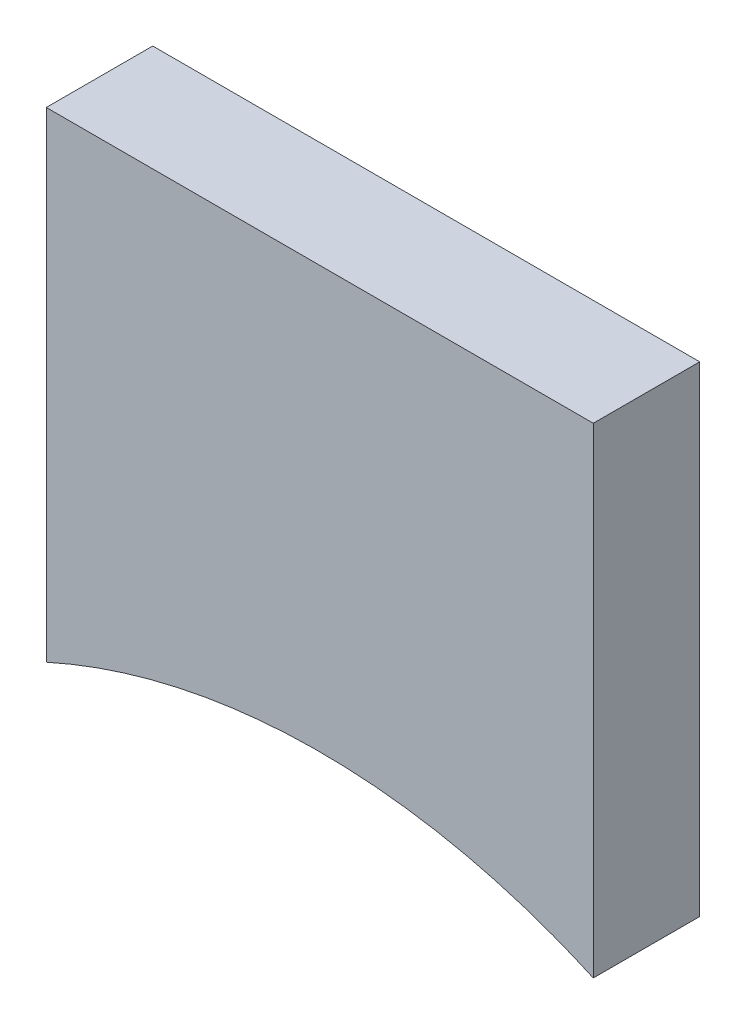
ISO-10303-21;
HEADER;
FILE_DESCRIPTION(('STEP AP214'),'2;1');
FILE_NAME('part.step','',(''),(''),'','','');
FILE_SCHEMA(('AUTOMOTIVE_DESIGN { 1 0 10303 214 1 1 1 1 }'));
ENDSEC;
DATA;
#1=APPLICATION_CONTEXT('core data for automotive mechanical design processes');
#2=APPLICATION_PROTOCOL_DEFINITION('international standard','automotive_design',2000,#1);
#3=PRODUCT_CONTEXT('',#1,'mechanical');
#4=PRODUCT('Part','Part','',(#3));
#5=PRODUCT_RELATED_PRODUCT_CATEGORY('part','',(#4));
#6=PRODUCT_DEFINITION_FORMATION('','',#4);
#7=PRODUCT_DEFINITION_CONTEXT('part definition',#1,'design');
#8=PRODUCT_DEFINITION('design','',#6,#7);
#9=PRODUCT_DEFINITION_SHAPE('','',#8);
#10=(LENGTH_UNIT() NAMED_UNIT(*) SI_UNIT(.MILLI.,.METRE.));
#11=(NAMED_UNIT(*) PLANE_ANGLE_UNIT() SI_UNIT($,.RADIAN.));
#12=(NAMED_UNIT(*) SI_UNIT($,.STERADIAN.) SOLID_ANGLE_UNIT());
#13=UNCERTAINTY_MEASURE_WITH_UNIT(LENGTH_MEASURE(1.E-05),#10,'distance_accuracy_value','');
#14=(GEOMETRIC_REPRESENTATION_CONTEXT(3) GLOBAL_UNCERTAINTY_ASSIGNED_CONTEXT((#13)) GLOBAL_UNIT_ASSIGNED_CONTEXT((#10,
#11,#12)) REPRESENTATION_CONTEXT('',''));
#15=CARTESIAN_POINT('',(0.,0.,0.));
#16=DIRECTION('',(0.,0.,1.));
#17=DIRECTION('',(1.,0.,0.));
#18=AXIS2_PLACEMENT_3D('',#15,#16,#17);
#19=CARTESIAN_POINT('',(23.8223531016636,-10.0590284761626,-1.08278048692806));
#20=CARTESIAN_POINT('',(21.9722049773914,-9.21980119114396,-1.08278045024425));
#21=CARTESIAN_POINT('',(20.122056706384,-10.0590281526722,-1.08278048692803));
#22=CARTESIAN_POINT('',(23.8223531016636,-10.0590285076348,-0.362780486928058));
#23=CARTESIAN_POINT('',(21.9722049773914,-9.21980122261617,-0.362780450244244));
#24=CARTESIAN_POINT('',(20.122056706384,-10.0590281841444,-0.36278048692803));
#25=(BOUNDED_SURFACE() B_SPLINE_SURFACE(1,2,((#19,#20,#21),(#22,#23,#24)),.UNSPECIFIED.,.F.,.F.,
.F.) B_SPLINE_SURFACE_WITH_KNOTS((2,2),(3,3),(0.,0.160756970940835),(-0.85168721602033,
1.04252364895218E-13),
.UNSPECIFIED.) GEOMETRIC_REPRESENTATION_ITEM() RATIONAL_B_SPLINE_SURFACE(((1.,0.910690571699547,
1.),(1.,0.910690571699547,1.))) REPRESENTATION_ITEM('') SURFACE());
#26=CARTESIAN_POINT('',(20.1220567063836,-10.0590281841446,-0.36278048692803));
#27=CARTESIAN_POINT('',(21.9722049773912,-9.21980122261628,-0.362780450244244));
#28=CARTESIAN_POINT('',(23.8223531016636,-10.0590285076349,-0.362780486928058));
#29=(BOUNDED_CURVE() B_SPLINE_CURVE(2,(#26,#27,#28),.UNSPECIFIED.,.F.,
.F.) B_SPLINE_CURVE_WITH_KNOTS((3,3),(0.,0.851687216020322),
.UNSPECIFIED.) CURVE() GEOMETRIC_REPRESENTATION_ITEM() RATIONAL_B_SPLINE_CURVE((1.,
0.910690571699551,1.)) REPRESENTATION_ITEM(''));
#30=CARTESIAN_POINT('',(20.1220567063836,-10.0590281841447,-0.36278048692803));
#31=VERTEX_POINT('',#30);
#32=CARTESIAN_POINT('',(23.8223531016636,-10.0590285076349,-0.362780486928059));
#33=VERTEX_POINT('',#32);
#34=EDGE_CURVE('E11',#31,#33,#29,.T.);
#35=CARTESIAN_POINT('',(20.1220567063836,-10.0590281526725,-1.08278048692803));
#36=CARTESIAN_POINT('',(20.1220567063836,-10.0590281841447,-0.36278048692803));
#37=(BOUNDED_CURVE() B_SPLINE_CURVE(1,(#35,#36),.UNSPECIFIED.,.F.,
.F.) B_SPLINE_CURVE_WITH_KNOTS((2,2),(0.,0.00072),
.UNSPECIFIED.) CURVE() GEOMETRIC_REPRESENTATION_ITEM() RATIONAL_B_SPLINE_CURVE((1.,1.)) REPRESENTATION_ITEM(''));
#38=CARTESIAN_POINT('',(20.1220567063836,-10.0590281526725,-1.08278048692803));
#39=VERTEX_POINT('',#38);
#40=EDGE_CURVE('E74',#39,#31,#37,.T.);
#41=CARTESIAN_POINT('',(23.8223531016636,-10.0590284761626,-1.08278048692805));
#42=CARTESIAN_POINT('',(21.9722049773911,-9.21980119114397,-1.08278045024424));
#43=CARTESIAN_POINT('',(20.1220567063835,-10.0590281526723,-1.08278048692802));
#44=(BOUNDED_CURVE() B_SPLINE_CURVE(2,(#41,#42,#43),.UNSPECIFIED.,.F.,
.F.) B_SPLINE_CURVE_WITH_KNOTS((3,3),(-0.851687216020322,1.03746451217817E-13),
.UNSPECIFIED.) CURVE() GEOMETRIC_REPRESENTATION_ITEM() RATIONAL_B_SPLINE_CURVE((1.,
0.910690571699553,1.)) REPRESENTATION_ITEM(''));
#45=CARTESIAN_POINT('',(23.8223531016636,-10.0590284761626,-1.08278048692806));
#46=VERTEX_POINT('',#45);
#47=EDGE_CURVE('E75',#46,#39,#44,.T.);
#48=CARTESIAN_POINT('',(23.8223531016636,-10.0590285076349,-0.362780486928059));
#49=CARTESIAN_POINT('',(23.8223531016636,-10.0590284761627,-1.08278048692806));
#50=(BOUNDED_CURVE() B_SPLINE_CURVE(1,(#48,#49),.UNSPECIFIED.,.F.,
.F.) B_SPLINE_CURVE_WITH_KNOTS((2,2),(0.,0.00072),
.UNSPECIFIED.) CURVE() GEOMETRIC_REPRESENTATION_ITEM() RATIONAL_B_SPLINE_CURVE((1.,1.)) REPRESENTATION_ITEM(''));
#51=EDGE_CURVE('E70',#33,#46,#50,.T.);
#52=ORIENTED_EDGE('',*,*,#34,.F.);
#53=ORIENTED_EDGE('',*,*,#40,.F.);
#54=ORIENTED_EDGE('',*,*,#47,.F.);
#55=ORIENTED_EDGE('',*,*,#51,.F.);
#56=EDGE_LOOP('',(#52,#53,#54,#55));
#57=FACE_BOUND('',#56,.T.);
#58=ADVANCED_FACE('F17',(#57),#25,.T.);
#59=CARTESIAN_POINT('',(19.7520270100307,-10.3840285076349,-0.362780501134251));
#60=CARTESIAN_POINT('',(19.7520273509796,-6.48402811944664,-0.362780330659738));
#61=CARTESIAN_POINT('',(24.1923830253156,-10.3840288958232,-0.362780501134285));
#62=CARTESIAN_POINT('',(24.1923833662644,-6.4840285076349,-0.362780330659772));
#63=(BOUNDED_SURFACE() B_SPLINE_SURFACE(1,1,((#59,#60),(#61,#62)),.UNSPECIFIED.,.F.,.F.,
.F.) B_SPLINE_SURFACE_WITH_KNOTS((2,2),(2,2),(-0.000370029667940436,0.00407032634734442),
(-0.000325000355839223,0.00357500003234905),
.UNSPECIFIED.) GEOMETRIC_REPRESENTATION_ITEM() RATIONAL_B_SPLINE_SURFACE(((1.,1.),(1.,1.))) REPRESENTATION_ITEM('') SURFACE());
#64=CARTESIAN_POINT('',(23.8223531016636,-10.0590285076349,-0.362780486928059));
#65=CARTESIAN_POINT('',(23.8223533857876,-6.80902850763487,-0.362780344865979));
#66=(BOUNDED_CURVE() B_SPLINE_CURVE(1,(#64,#65),.UNSPECIFIED.,.F.,
.F.) B_SPLINE_CURVE_WITH_KNOTS((2,2),(0.,0.00325),
.UNSPECIFIED.) CURVE() GEOMETRIC_REPRESENTATION_ITEM() RATIONAL_B_SPLINE_CURVE((1.,1.)) REPRESENTATION_ITEM(''));
#67=CARTESIAN_POINT('',(23.8223533857876,-6.80902850763487,-0.362780344865978));
#68=VERTEX_POINT('',#67);
#69=EDGE_CURVE('E32',#33,#68,#66,.T.);
#70=CARTESIAN_POINT('',(20.1220569905076,-6.80902818414469,-0.36278034486595));
#71=CARTESIAN_POINT('',(23.8223533857876,-6.80902850763487,-0.362780344865978));
#72=(BOUNDED_CURVE() B_SPLINE_CURVE(1,(#70,#71),.UNSPECIFIED.,.F.,
.F.) B_SPLINE_CURVE_WITH_KNOTS((2,2),(0.,0.00370029639528),
.UNSPECIFIED.) CURVE() GEOMETRIC_REPRESENTATION_ITEM() RATIONAL_B_SPLINE_CURVE((1.,1.)) REPRESENTATION_ITEM(''));
#73=CARTESIAN_POINT('',(20.1220569905076,-6.80902818414469,-0.36278034486595));
#74=VERTEX_POINT('',#73);
#75=EDGE_CURVE('E90',#74,#68,#72,.T.);
#76=CARTESIAN_POINT('',(20.1220567063836,-10.0590281841447,-0.36278048692803));
#77=CARTESIAN_POINT('',(20.1220569905076,-6.80902818414469,-0.36278034486595));
#78=(BOUNDED_CURVE() B_SPLINE_CURVE(1,(#76,#77),.UNSPECIFIED.,.F.,
.F.) B_SPLINE_CURVE_WITH_KNOTS((2,2),(0.,0.00325),
.UNSPECIFIED.) CURVE() GEOMETRIC_REPRESENTATION_ITEM() RATIONAL_B_SPLINE_CURVE((1.,1.)) REPRESENTATION_ITEM(''));
#79=EDGE_CURVE('E65',#31,#74,#78,.T.);
#80=ORIENTED_EDGE('',*,*,#34,.T.);
#81=ORIENTED_EDGE('',*,*,#69,.T.);
#82=ORIENTED_EDGE('',*,*,#75,.F.);
#83=ORIENTED_EDGE('',*,*,#79,.F.);
#84=EDGE_LOOP('',(#80,#81,#82,#83));
#85=FACE_BOUND('',#84,.T.);
#86=ADVANCED_FACE('F167',(#85),#63,.T.);
#87=CARTESIAN_POINT('',(23.8223530732512,-10.3840285107821,-0.290780501134265));
#88=CARTESIAN_POINT('',(23.8223534142,-6.48402851078209,-0.29078033065977));
#89=CARTESIAN_POINT('',(23.8223530732512,-10.3840284730155,-1.15478050113427));
#90=CARTESIAN_POINT('',(23.8223534142,-6.48402847301543,-1.15478033065977));
#91=(BOUNDED_SURFACE() B_SPLINE_SURFACE(1,1,((#87,#88),(#89,#90)),.UNSPECIFIED.,.F.,.F.,
.F.) B_SPLINE_SURFACE_WITH_KNOTS((2,2),(2,2),(-7.20000000000017E-05,0.000792),
(-0.000325000000000005,0.00357500000000005),
.UNSPECIFIED.) GEOMETRIC_REPRESENTATION_ITEM() RATIONAL_B_SPLINE_SURFACE(((1.,1.),(1.,1.))) REPRESENTATION_ITEM('') SURFACE());
#92=CARTESIAN_POINT('',(23.8223531016636,-10.0590284761626,-1.08278048692806));
#93=CARTESIAN_POINT('',(23.8223533857876,-6.80902847616266,-1.08278034486598));
#94=(BOUNDED_CURVE() B_SPLINE_CURVE(1,(#92,#93),.UNSPECIFIED.,.F.,
.F.) B_SPLINE_CURVE_WITH_KNOTS((2,2),(0.,0.00324999999999994),
.UNSPECIFIED.) CURVE() GEOMETRIC_REPRESENTATION_ITEM() RATIONAL_B_SPLINE_CURVE((1.,1.)) REPRESENTATION_ITEM(''));
#95=CARTESIAN_POINT('',(23.8223533857876,-6.80902847616266,-1.08278034486598));
#96=VERTEX_POINT('',#95);
#97=EDGE_CURVE('E51',#46,#96,#94,.T.);
#98=CARTESIAN_POINT('',(23.8223533857876,-6.80902850763487,-0.362780344865978));
#99=CARTESIAN_POINT('',(23.8223533857876,-6.80902847616266,-1.08278034486598));
#100=(BOUNDED_CURVE() B_SPLINE_CURVE(1,(#98,#99),.UNSPECIFIED.,.F.,
.F.) B_SPLINE_CURVE_WITH_KNOTS((2,2),(0.,0.00072),
.UNSPECIFIED.) CURVE() GEOMETRIC_REPRESENTATION_ITEM() RATIONAL_B_SPLINE_CURVE((1.,1.)) REPRESENTATION_ITEM(''));
#101=EDGE_CURVE('E85',#68,#96,#100,.T.);
#102=ORIENTED_EDGE('',*,*,#51,.T.);
#103=ORIENTED_EDGE('',*,*,#97,.T.);
#104=ORIENTED_EDGE('',*,*,#101,.F.);
#105=ORIENTED_EDGE('',*,*,#69,.F.);
#106=EDGE_LOOP('',(#102,#103,#104,#105));
#107=FACE_BOUND('',#106,.T.);
#108=ADVANCED_FACE('F166',(#107),#91,.T.);
#109=CARTESIAN_POINT('',(20.1220566779712,-10.3840281495253,-1.15478050113424));
#110=CARTESIAN_POINT('',(20.12205701892,-6.48402814952525,-1.15478033065974));
#111=CARTESIAN_POINT('',(20.1220566779712,-10.3840281872919,-0.290780501134238));
#112=CARTESIAN_POINT('',(20.12205701892,-6.48402818729191,-0.290780330659742));
#113=(BOUNDED_SURFACE() B_SPLINE_SURFACE(1,1,((#109,#110),(#111,#112)),.UNSPECIFIED.,.F.,.F.,
.F.) B_SPLINE_SURFACE_WITH_KNOTS((2,2),(2,2),(-7.2E-05,0.000792),(-0.000325000000000005,
0.003575),.UNSPECIFIED.) GEOMETRIC_REPRESENTATION_ITEM() RATIONAL_B_SPLINE_SURFACE(((1.,1.),(1.,1.))) REPRESENTATION_ITEM('') SURFACE());
#114=CARTESIAN_POINT('',(20.1220569905076,-6.80902815267248,-1.08278034486595));
#115=CARTESIAN_POINT('',(20.1220569905076,-6.80902818414469,-0.36278034486595));
#116=(BOUNDED_CURVE() B_SPLINE_CURVE(1,(#114,#115),.UNSPECIFIED.,.F.,
.F.) B_SPLINE_CURVE_WITH_KNOTS((2,2),(0.,0.00072),
.UNSPECIFIED.) CURVE() GEOMETRIC_REPRESENTATION_ITEM() RATIONAL_B_SPLINE_CURVE((1.,1.)) REPRESENTATION_ITEM(''));
#117=CARTESIAN_POINT('',(20.1220569905076,-6.80902815267248,-1.08278034486595));
#118=VERTEX_POINT('',#117);
#119=EDGE_CURVE('E80',#118,#74,#116,.T.);
#120=CARTESIAN_POINT('',(20.1220567063836,-10.0590281526725,-1.08278048692803));
#121=CARTESIAN_POINT('',(20.1220569905076,-6.80902815267248,-1.08278034486595));
#122=(BOUNDED_CURVE() B_SPLINE_CURVE(1,(#120,#121),.UNSPECIFIED.,.F.,
.F.) B_SPLINE_CURVE_WITH_KNOTS((2,2),(0.,0.00325),
.UNSPECIFIED.) CURVE() GEOMETRIC_REPRESENTATION_ITEM() RATIONAL_B_SPLINE_CURVE((1.,1.)) REPRESENTATION_ITEM(''));
#123=EDGE_CURVE('E23',#39,#118,#122,.T.);
#124=ORIENTED_EDGE('',*,*,#40,.T.);
#125=ORIENTED_EDGE('',*,*,#79,.T.);
#126=ORIENTED_EDGE('',*,*,#119,.F.);
#127=ORIENTED_EDGE('',*,*,#123,.F.);
#128=EDGE_LOOP('',(#124,#125,#126,#127));
#129=FACE_BOUND('',#128,.T.);
#130=ADVANCED_FACE('F78',(#129),#113,.T.);
#131=CARTESIAN_POINT('',(24.1923827127792,-10.3840285085117,-1.08278050113427));
#132=CARTESIAN_POINT('',(24.192383053728,-6.48402850851167,-1.08278033065978));
#133=CARTESIAN_POINT('',(19.7520270384431,-10.3840281203235,-1.08278050113424));
#134=CARTESIAN_POINT('',(19.752027379392,-6.48402812032345,-1.08278033065974));
#135=(BOUNDED_SURFACE() B_SPLINE_SURFACE(1,1,((#131,#132),(#133,#134)),.UNSPECIFIED.,.F.,.F.,
.F.) B_SPLINE_SURFACE_WITH_KNOTS((2,2),(2,2),(-0.000370029639528023,0.00407032603480809),
(-0.000325000000000091,0.003575),
.UNSPECIFIED.) GEOMETRIC_REPRESENTATION_ITEM() RATIONAL_B_SPLINE_SURFACE(((1.,1.),(1.,1.))) REPRESENTATION_ITEM('') SURFACE());
#136=CARTESIAN_POINT('',(23.8223533857876,-6.80902847616266,-1.08278034486598));
#137=CARTESIAN_POINT('',(20.1220569905076,-6.80902815267248,-1.08278034486595));
#138=(BOUNDED_CURVE() B_SPLINE_CURVE(1,(#136,#137),.UNSPECIFIED.,.F.,
.F.) B_SPLINE_CURVE_WITH_KNOTS((2,2),(0.,0.00370029639528),
.UNSPECIFIED.) CURVE() GEOMETRIC_REPRESENTATION_ITEM() RATIONAL_B_SPLINE_CURVE((1.,1.)) REPRESENTATION_ITEM(''));
#139=EDGE_CURVE('E146',#96,#118,#138,.T.);
#140=ORIENTED_EDGE('',*,*,#47,.T.);
#141=ORIENTED_EDGE('',*,*,#123,.T.);
#142=ORIENTED_EDGE('',*,*,#139,.F.);
#143=ORIENTED_EDGE('',*,*,#97,.F.);
#144=EDGE_LOOP('',(#140,#141,#142,#143));
#145=FACE_BOUND('',#144,.T.);
#146=ADVANCED_FACE('F83',(#145),#135,.T.);
#147=CARTESIAN_POINT('',(19.7520273509796,-6.8090281549429,-0.290780344865947));
#148=CARTESIAN_POINT('',(19.7520273509796,-6.80902811717624,-1.15478034486595));
#149=CARTESIAN_POINT('',(24.1923830253156,-6.80902854313112,-0.29078034486598));
#150=CARTESIAN_POINT('',(24.1923830253156,-6.80902850536446,-1.15478034486598));
#151=(BOUNDED_SURFACE() B_SPLINE_SURFACE(1,1,((#147,#148),(#149,#150)),.UNSPECIFIED.,.F.,.F.,
.F.) B_SPLINE_SURFACE_WITH_KNOTS((2,2),(2,2),(-0.00222017783716801,0.00222017783716802),
(-0.000432,0.000432),
.UNSPECIFIED.) GEOMETRIC_REPRESENTATION_ITEM() RATIONAL_B_SPLINE_SURFACE(((1.,1.),(1.,1.))) REPRESENTATION_ITEM('') SURFACE());
#152=ORIENTED_EDGE('',*,*,#139,.T.);
#153=ORIENTED_EDGE('',*,*,#119,.T.);
#154=ORIENTED_EDGE('',*,*,#75,.T.);
#155=ORIENTED_EDGE('',*,*,#101,.T.);
#156=EDGE_LOOP('',(#152,#153,#154,#155));
#157=FACE_BOUND('',#156,.T.);
#158=ADVANCED_FACE('F19',(#157),#151,.T.);
#159=CLOSED_SHELL('',(#58,#86,#108,#130,#146,#158));
#160=MANIFOLD_SOLID_BREP('B1',#159);
#161=ADVANCED_BREP_SHAPE_REPRESENTATION('',(#18,#160),#14);
#162=SHAPE_DEFINITION_REPRESENTATION(#9,#161);
ENDSEC;
END-ISO-10303-21;
